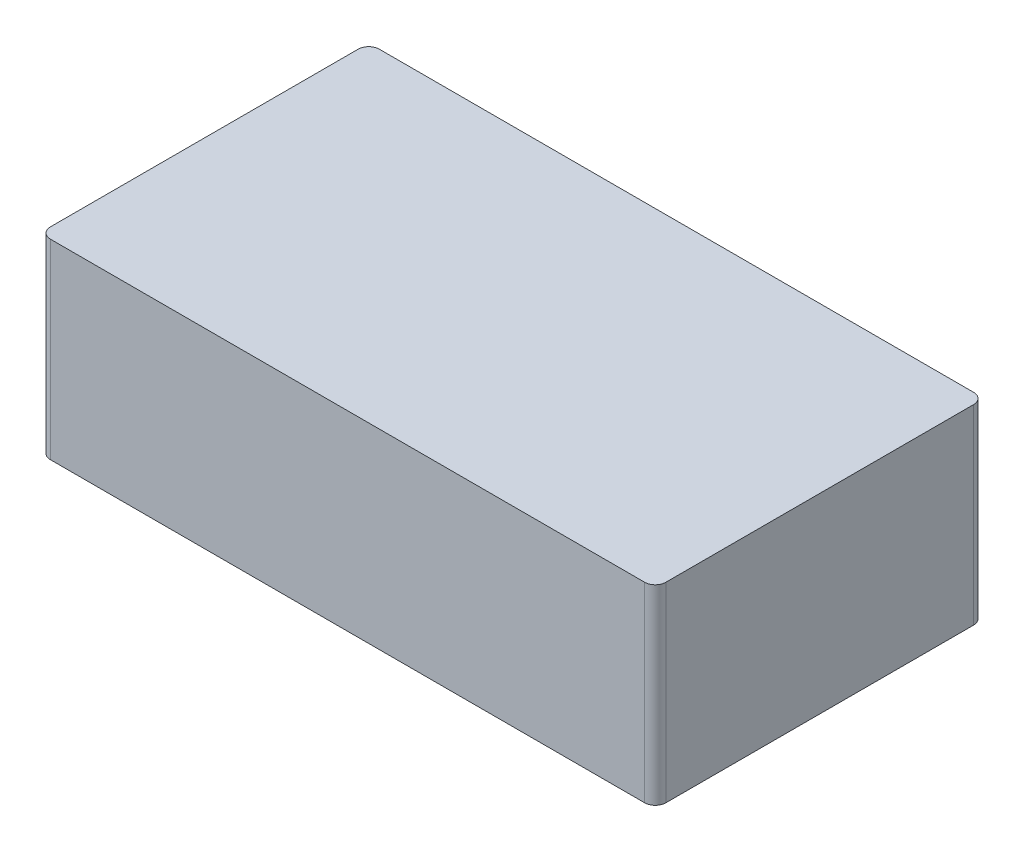
ISO-10303-21;
HEADER;
FILE_DESCRIPTION(('STEP AP214'),'2;1');
FILE_NAME('part.step','',(''),(''),'','','');
FILE_SCHEMA(('AUTOMOTIVE_DESIGN { 1 0 10303 214 1 1 1 1 }'));
ENDSEC;
DATA;
#1=APPLICATION_CONTEXT('core data for automotive mechanical design processes');
#2=APPLICATION_PROTOCOL_DEFINITION('international standard','automotive_design',2000,#1);
#3=PRODUCT_CONTEXT('',#1,'mechanical');
#4=PRODUCT('Part','Part','',(#3));
#5=PRODUCT_RELATED_PRODUCT_CATEGORY('part','',(#4));
#6=PRODUCT_DEFINITION_FORMATION('','',#4);
#7=PRODUCT_DEFINITION_CONTEXT('part definition',#1,'design');
#8=PRODUCT_DEFINITION('design','',#6,#7);
#9=PRODUCT_DEFINITION_SHAPE('','',#8);
#10=(LENGTH_UNIT() NAMED_UNIT(*) SI_UNIT(.MILLI.,.METRE.));
#11=(NAMED_UNIT(*) PLANE_ANGLE_UNIT() SI_UNIT($,.RADIAN.));
#12=(NAMED_UNIT(*) SI_UNIT($,.STERADIAN.) SOLID_ANGLE_UNIT());
#13=UNCERTAINTY_MEASURE_WITH_UNIT(LENGTH_MEASURE(1.E-05),#10,'distance_accuracy_value','');
#14=(GEOMETRIC_REPRESENTATION_CONTEXT(3) GLOBAL_UNCERTAINTY_ASSIGNED_CONTEXT((#13)) GLOBAL_UNIT_ASSIGNED_CONTEXT((#10,
#11,#12)) REPRESENTATION_CONTEXT('',''));
#15=CARTESIAN_POINT('',(0.,0.,0.));
#16=DIRECTION('',(0.,0.,1.));
#17=DIRECTION('',(1.,0.,0.));
#18=AXIS2_PLACEMENT_3D('',#15,#16,#17);
#19=CARTESIAN_POINT('',(0.,18.,0.));
#20=DIRECTION('',(1.,0.,0.));
#21=DIRECTION('',(0.,0.,-1.));
#22=AXIS2_PLACEMENT_3D('',#19,#20,#21);
#23=PLANE('',#22);
#24=DIRECTION('',(0.,0.,1.));
#25=VECTOR('',#24,1.);
#26=CARTESIAN_POINT('',(0.,18.,0.));
#27=LINE('',#26,#25);
#28=CARTESIAN_POINT('',(0.,18.,-30.));
#29=VERTEX_POINT('',#28);
#30=CARTESIAN_POINT('',(0.,18.,-1.));
#31=VERTEX_POINT('',#30);
#32=EDGE_CURVE('E118',#29,#31,#27,.T.);
#33=ORIENTED_EDGE('',*,*,#32,.F.);
#34=DIRECTION('',(0.,-1.,0.));
#35=VECTOR('',#34,1.);
#36=CARTESIAN_POINT('',(0.,18.,-30.));
#37=LINE('',#36,#35);
#38=CARTESIAN_POINT('',(0.,0.,-30.));
#39=VERTEX_POINT('',#38);
#40=EDGE_CURVE('E103',#29,#39,#37,.T.);
#41=ORIENTED_EDGE('',*,*,#40,.T.);
#42=DIRECTION('',(0.,0.,1.));
#43=VECTOR('',#42,1.);
#44=CARTESIAN_POINT('',(0.,0.,0.));
#45=LINE('',#44,#43);
#46=CARTESIAN_POINT('',(0.,0.,-1.));
#47=VERTEX_POINT('',#46);
#48=EDGE_CURVE('E115',#39,#47,#45,.T.);
#49=ORIENTED_EDGE('',*,*,#48,.T.);
#50=DIRECTION('',(0.,-1.,0.));
#51=VECTOR('',#50,1.);
#52=CARTESIAN_POINT('',(0.,18.,-1.));
#53=LINE('',#52,#51);
#54=EDGE_CURVE('E120',#47,#31,#53,.F.);
#55=ORIENTED_EDGE('',*,*,#54,.T.);
#56=EDGE_LOOP('',(#33,#41,#49,#55));
#57=FACE_BOUND('',#56,.T.);
#58=ADVANCED_FACE('F33',(#57),#23,.F.);
#59=CARTESIAN_POINT('',(0.,18.,0.));
#60=DIRECTION('',(0.,0.,-1.));
#61=DIRECTION('',(-1.,0.,0.));
#62=AXIS2_PLACEMENT_3D('',#59,#60,#61);
#63=PLANE('',#62);
#64=DIRECTION('',(1.,0.,0.));
#65=VECTOR('',#64,1.);
#66=CARTESIAN_POINT('',(0.,0.,0.));
#67=LINE('',#66,#65);
#68=CARTESIAN_POINT('',(1.,0.,0.));
#69=VERTEX_POINT('',#68);
#70=CARTESIAN_POINT('',(56.9999999999999,0.,0.));
#71=VERTEX_POINT('',#70);
#72=EDGE_CURVE('E124',#69,#71,#67,.T.);
#73=ORIENTED_EDGE('',*,*,#72,.T.);
#74=DIRECTION('',(0.,-1.,0.));
#75=VECTOR('',#74,1.);
#76=CARTESIAN_POINT('',(56.9999999999999,18.,0.));
#77=LINE('',#76,#75);
#78=CARTESIAN_POINT('',(56.9999999999999,18.,0.));
#79=VERTEX_POINT('',#78);
#80=EDGE_CURVE('E11',#71,#79,#77,.F.);
#81=ORIENTED_EDGE('',*,*,#80,.T.);
#82=DIRECTION('',(1.,0.,0.));
#83=VECTOR('',#82,1.);
#84=CARTESIAN_POINT('',(0.,18.,0.));
#85=LINE('',#84,#83);
#86=CARTESIAN_POINT('',(1.,18.,0.));
#87=VERTEX_POINT('',#86);
#88=EDGE_CURVE('E160',#87,#79,#85,.T.);
#89=ORIENTED_EDGE('',*,*,#88,.F.);
#90=DIRECTION('',(0.,-1.,0.));
#91=VECTOR('',#90,1.);
#92=CARTESIAN_POINT('',(1.,18.,0.));
#93=LINE('',#92,#91);
#94=EDGE_CURVE('E41',#87,#69,#93,.T.);
#95=ORIENTED_EDGE('',*,*,#94,.T.);
#96=EDGE_LOOP('',(#73,#81,#89,#95));
#97=FACE_BOUND('',#96,.T.);
#98=ADVANCED_FACE('F158',(#97),#63,.F.);
#99=CARTESIAN_POINT('',(57.9999999999999,18.,0.));
#100=DIRECTION('',(-1.,0.,0.));
#101=DIRECTION('',(0.,0.,1.));
#102=AXIS2_PLACEMENT_3D('',#99,#100,#101);
#103=PLANE('',#102);
#104=DIRECTION('',(0.,0.,-1.));
#105=VECTOR('',#104,1.);
#106=CARTESIAN_POINT('',(57.9999999999999,0.,0.));
#107=LINE('',#106,#105);
#108=CARTESIAN_POINT('',(57.9999999999999,0.,-0.999999999999998));
#109=VERTEX_POINT('',#108);
#110=CARTESIAN_POINT('',(58.,0.,-30.));
#111=VERTEX_POINT('',#110);
#112=EDGE_CURVE('E127',#109,#111,#107,.T.);
#113=ORIENTED_EDGE('',*,*,#112,.T.);
#114=DIRECTION('',(0.,-1.,0.));
#115=VECTOR('',#114,1.);
#116=CARTESIAN_POINT('',(58.,18.,-30.));
#117=LINE('',#116,#115);
#118=CARTESIAN_POINT('',(58.,18.,-30.));
#119=VERTEX_POINT('',#118);
#120=EDGE_CURVE('E48',#111,#119,#117,.F.);
#121=ORIENTED_EDGE('',*,*,#120,.T.);
#122=DIRECTION('',(0.,0.,-1.));
#123=VECTOR('',#122,1.);
#124=CARTESIAN_POINT('',(57.9999999999999,18.,0.));
#125=LINE('',#124,#123);
#126=CARTESIAN_POINT('',(57.9999999999999,18.,-0.999999999999998));
#127=VERTEX_POINT('',#126);
#128=EDGE_CURVE('E168',#127,#119,#125,.T.);
#129=ORIENTED_EDGE('',*,*,#128,.F.);
#130=DIRECTION('',(0.,-1.,0.));
#131=VECTOR('',#130,1.);
#132=CARTESIAN_POINT('',(57.9999999999999,18.,-0.999999999999998));
#133=LINE('',#132,#131);
#134=EDGE_CURVE('E151',#127,#109,#133,.T.);
#135=ORIENTED_EDGE('',*,*,#134,.T.);
#136=EDGE_LOOP('',(#113,#121,#129,#135));
#137=FACE_BOUND('',#136,.T.);
#138=ADVANCED_FACE('F167',(#137),#103,.F.);
#139=CARTESIAN_POINT('',(0.,18.,-31.));
#140=DIRECTION('',(0.,0.,1.));
#141=DIRECTION('',(1.,0.,0.));
#142=AXIS2_PLACEMENT_3D('',#139,#140,#141);
#143=PLANE('',#142);
#144=DIRECTION('',(-1.,0.,0.));
#145=VECTOR('',#144,1.);
#146=CARTESIAN_POINT('',(0.,0.,-31.));
#147=LINE('',#146,#145);
#148=CARTESIAN_POINT('',(57.,0.,-31.));
#149=VERTEX_POINT('',#148);
#150=CARTESIAN_POINT('',(1.,0.,-31.));
#151=VERTEX_POINT('',#150);
#152=EDGE_CURVE('E134',#149,#151,#147,.T.);
#153=ORIENTED_EDGE('',*,*,#152,.T.);
#154=DIRECTION('',(0.,-1.,0.));
#155=VECTOR('',#154,1.);
#156=CARTESIAN_POINT('',(1.,18.,-31.));
#157=LINE('',#156,#155);
#158=CARTESIAN_POINT('',(1.,18.,-31.));
#159=VERTEX_POINT('',#158);
#160=EDGE_CURVE('E104',#151,#159,#157,.F.);
#161=ORIENTED_EDGE('',*,*,#160,.T.);
#162=DIRECTION('',(-1.,0.,0.));
#163=VECTOR('',#162,1.);
#164=CARTESIAN_POINT('',(0.,18.,-31.));
#165=LINE('',#164,#163);
#166=CARTESIAN_POINT('',(57.,18.,-31.));
#167=VERTEX_POINT('',#166);
#168=EDGE_CURVE('E130',#167,#159,#165,.T.);
#169=ORIENTED_EDGE('',*,*,#168,.F.);
#170=DIRECTION('',(0.,-1.,0.));
#171=VECTOR('',#170,1.);
#172=CARTESIAN_POINT('',(57.,18.,-31.));
#173=LINE('',#172,#171);
#174=EDGE_CURVE('E109',#167,#149,#173,.T.);
#175=ORIENTED_EDGE('',*,*,#174,.T.);
#176=EDGE_LOOP('',(#153,#161,#169,#175));
#177=FACE_BOUND('',#176,.T.);
#178=ADVANCED_FACE('F196',(#177),#143,.F.);
#179=CARTESIAN_POINT('',(0.,18.,0.));
#180=DIRECTION('',(0.,-1.,0.));
#181=DIRECTION('',(0.,0.,-1.));
#182=AXIS2_PLACEMENT_3D('',#179,#180,#181);
#183=PLANE('',#182);
#184=ORIENTED_EDGE('',*,*,#168,.T.);
#185=CARTESIAN_POINT('',(1.,18.,-30.));
#186=DIRECTION('',(0.,-1.,0.));
#187=DIRECTION('',(0.,0.,-1.));
#188=AXIS2_PLACEMENT_3D('',#185,#186,#187);
#189=CIRCLE('',#188,1.);
#190=EDGE_CURVE('E149',#159,#29,#189,.F.);
#191=ORIENTED_EDGE('',*,*,#190,.T.);
#192=ORIENTED_EDGE('',*,*,#32,.T.);
#193=CARTESIAN_POINT('',(1.,18.,-1.));
#194=DIRECTION('',(0.,-1.,0.));
#195=DIRECTION('',(0.,0.,-1.));
#196=AXIS2_PLACEMENT_3D('',#193,#194,#195);
#197=CIRCLE('',#196,1.);
#198=EDGE_CURVE('E144',#31,#87,#197,.F.);
#199=ORIENTED_EDGE('',*,*,#198,.T.);
#200=ORIENTED_EDGE('',*,*,#88,.T.);
#201=CARTESIAN_POINT('',(56.9999999999999,18.,-1.));
#202=DIRECTION('',(0.,-1.,0.));
#203=DIRECTION('',(0.,0.,-1.));
#204=AXIS2_PLACEMENT_3D('',#201,#202,#203);
#205=CIRCLE('',#204,1.);
#206=EDGE_CURVE('E55',#79,#127,#205,.F.);
#207=ORIENTED_EDGE('',*,*,#206,.T.);
#208=ORIENTED_EDGE('',*,*,#128,.T.);
#209=CARTESIAN_POINT('',(57.,18.,-30.));
#210=DIRECTION('',(0.,-1.,0.));
#211=DIRECTION('',(0.,0.,-1.));
#212=AXIS2_PLACEMENT_3D('',#209,#210,#211);
#213=CIRCLE('',#212,1.);
#214=EDGE_CURVE('E147',#119,#167,#213,.F.);
#215=ORIENTED_EDGE('',*,*,#214,.T.);
#216=EDGE_LOOP('',(#184,#191,#192,#199,#200,#207,#208,#215));
#217=FACE_BOUND('',#216,.T.);
#218=ADVANCED_FACE('F173',(#217),#183,.F.);
#219=CARTESIAN_POINT('',(0.,0.,0.));
#220=DIRECTION('',(0.,-1.,0.));
#221=DIRECTION('',(0.,0.,-1.));
#222=AXIS2_PLACEMENT_3D('',#219,#220,#221);
#223=PLANE('',#222);
#224=ORIENTED_EDGE('',*,*,#48,.F.);
#225=CARTESIAN_POINT('',(1.,0.,-30.));
#226=DIRECTION('',(0.,-1.,0.));
#227=DIRECTION('',(0.,0.,-1.));
#228=AXIS2_PLACEMENT_3D('',#225,#226,#227);
#229=CIRCLE('',#228,1.);
#230=EDGE_CURVE('E99',#39,#151,#229,.T.);
#231=ORIENTED_EDGE('',*,*,#230,.T.);
#232=ORIENTED_EDGE('',*,*,#152,.F.);
#233=CARTESIAN_POINT('',(57.,0.,-30.));
#234=DIRECTION('',(0.,-1.,0.));
#235=DIRECTION('',(0.,0.,-1.));
#236=AXIS2_PLACEMENT_3D('',#233,#234,#235);
#237=CIRCLE('',#236,1.);
#238=EDGE_CURVE('E110',#149,#111,#237,.T.);
#239=ORIENTED_EDGE('',*,*,#238,.T.);
#240=ORIENTED_EDGE('',*,*,#112,.F.);
#241=CARTESIAN_POINT('',(56.9999999999999,0.,-1.));
#242=DIRECTION('',(0.,-1.,0.));
#243=DIRECTION('',(0.,0.,-1.));
#244=AXIS2_PLACEMENT_3D('',#241,#242,#243);
#245=CIRCLE('',#244,1.);
#246=EDGE_CURVE('E138',#109,#71,#245,.T.);
#247=ORIENTED_EDGE('',*,*,#246,.T.);
#248=ORIENTED_EDGE('',*,*,#72,.F.);
#249=CARTESIAN_POINT('',(1.,0.,-1.));
#250=DIRECTION('',(0.,-1.,0.));
#251=DIRECTION('',(0.,0.,-1.));
#252=AXIS2_PLACEMENT_3D('',#249,#250,#251);
#253=CIRCLE('',#252,1.);
#254=EDGE_CURVE('E119',#69,#47,#253,.T.);
#255=ORIENTED_EDGE('',*,*,#254,.T.);
#256=EDGE_LOOP('',(#224,#231,#232,#239,#240,#247,#248,#255));
#257=FACE_BOUND('',#256,.T.);
#258=ADVANCED_FACE('F122',(#257),#223,.T.);
#259=CARTESIAN_POINT('',(1.,18.,-30.));
#260=DIRECTION('',(0.,-1.,0.));
#261=DIRECTION('',(0.,0.,-1.));
#262=AXIS2_PLACEMENT_3D('',#259,#260,#261);
#263=CYLINDRICAL_SURFACE('',#262,1.);
#264=ORIENTED_EDGE('',*,*,#190,.F.);
#265=ORIENTED_EDGE('',*,*,#160,.F.);
#266=ORIENTED_EDGE('',*,*,#230,.F.);
#267=ORIENTED_EDGE('',*,*,#40,.F.);
#268=EDGE_LOOP('',(#264,#265,#266,#267));
#269=FACE_BOUND('',#268,.T.);
#270=ADVANCED_FACE('F102',(#269),#263,.T.);
#271=CARTESIAN_POINT('',(57.,18.,-30.));
#272=DIRECTION('',(0.,-1.,0.));
#273=DIRECTION('',(0.,0.,-1.));
#274=AXIS2_PLACEMENT_3D('',#271,#272,#273);
#275=CYLINDRICAL_SURFACE('',#274,1.);
#276=ORIENTED_EDGE('',*,*,#214,.F.);
#277=ORIENTED_EDGE('',*,*,#120,.F.);
#278=ORIENTED_EDGE('',*,*,#238,.F.);
#279=ORIENTED_EDGE('',*,*,#174,.F.);
#280=EDGE_LOOP('',(#276,#277,#278,#279));
#281=FACE_BOUND('',#280,.T.);
#282=ADVANCED_FACE('F178',(#281),#275,.T.);
#283=CARTESIAN_POINT('',(56.9999999999999,18.,-1.));
#284=DIRECTION('',(0.,-1.,0.));
#285=DIRECTION('',(0.,0.,-1.));
#286=AXIS2_PLACEMENT_3D('',#283,#284,#285);
#287=CYLINDRICAL_SURFACE('',#286,1.);
#288=ORIENTED_EDGE('',*,*,#206,.F.);
#289=ORIENTED_EDGE('',*,*,#80,.F.);
#290=ORIENTED_EDGE('',*,*,#246,.F.);
#291=ORIENTED_EDGE('',*,*,#134,.F.);
#292=EDGE_LOOP('',(#288,#289,#290,#291));
#293=FACE_BOUND('',#292,.T.);
#294=ADVANCED_FACE('F166',(#293),#287,.T.);
#295=CARTESIAN_POINT('',(1.,18.,-1.));
#296=DIRECTION('',(0.,-1.,0.));
#297=DIRECTION('',(0.,0.,-1.));
#298=AXIS2_PLACEMENT_3D('',#295,#296,#297);
#299=CYLINDRICAL_SURFACE('',#298,1.);
#300=ORIENTED_EDGE('',*,*,#198,.F.);
#301=ORIENTED_EDGE('',*,*,#54,.F.);
#302=ORIENTED_EDGE('',*,*,#254,.F.);
#303=ORIENTED_EDGE('',*,*,#94,.F.);
#304=EDGE_LOOP('',(#300,#301,#302,#303));
#305=FACE_BOUND('',#304,.T.);
#306=ADVANCED_FACE('F35',(#305),#299,.T.);
#307=CLOSED_SHELL('',(#58,#98,#138,#178,#218,#258,#270,#282,#294,#306));
#308=MANIFOLD_SOLID_BREP('B2',#307);
#309=ADVANCED_BREP_SHAPE_REPRESENTATION('',(#18,#308),#14);
#310=SHAPE_DEFINITION_REPRESENTATION(#9,#309);
ENDSEC;
END-ISO-10303-21;
